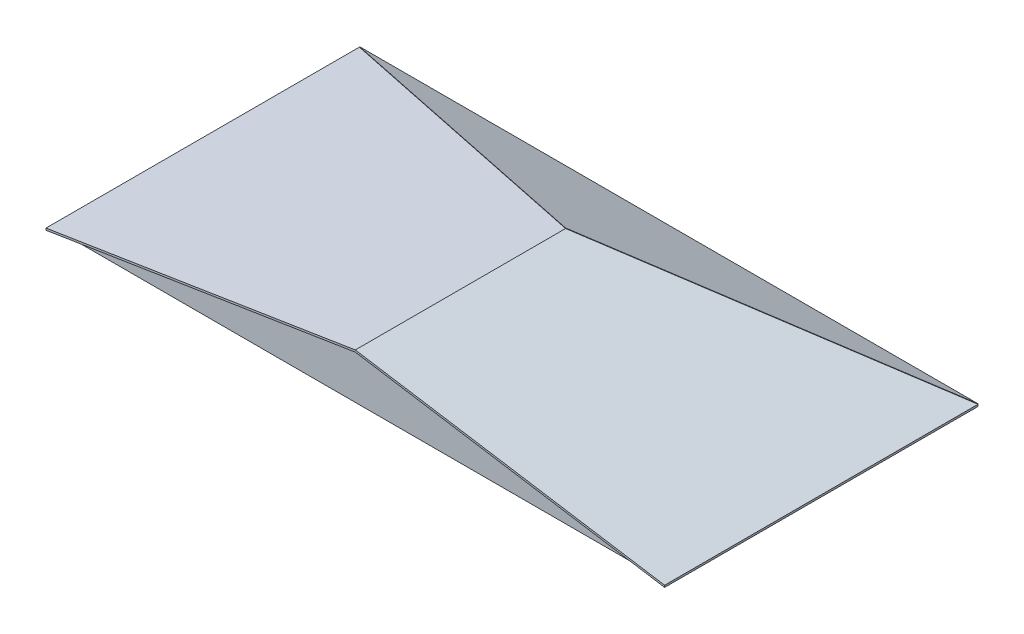
ISO-10303-21;
HEADER;
FILE_DESCRIPTION(('STEP AP214'),'2;1');
FILE_NAME('part.step','',(''),(''),'','','');
FILE_SCHEMA(('AUTOMOTIVE_DESIGN { 1 0 10303 214 1 1 1 1 }'));
ENDSEC;
DATA;
#1=APPLICATION_CONTEXT('core data for automotive mechanical design processes');
#2=APPLICATION_PROTOCOL_DEFINITION('international standard','automotive_design',2000,#1);
#3=PRODUCT_CONTEXT('',#1,'mechanical');
#4=PRODUCT('Part','Part','',(#3));
#5=PRODUCT_RELATED_PRODUCT_CATEGORY('part','',(#4));
#6=PRODUCT_DEFINITION_FORMATION('','',#4);
#7=PRODUCT_DEFINITION_CONTEXT('part definition',#1,'design');
#8=PRODUCT_DEFINITION('design','',#6,#7);
#9=PRODUCT_DEFINITION_SHAPE('','',#8);
#10=(LENGTH_UNIT() NAMED_UNIT(*) SI_UNIT(.MILLI.,.METRE.));
#11=(NAMED_UNIT(*) PLANE_ANGLE_UNIT() SI_UNIT($,.RADIAN.));
#12=(NAMED_UNIT(*) SI_UNIT($,.STERADIAN.) SOLID_ANGLE_UNIT());
#13=UNCERTAINTY_MEASURE_WITH_UNIT(LENGTH_MEASURE(1.E-05),#10,'distance_accuracy_value','');
#14=(GEOMETRIC_REPRESENTATION_CONTEXT(3) GLOBAL_UNCERTAINTY_ASSIGNED_CONTEXT((#13)) GLOBAL_UNIT_ASSIGNED_CONTEXT((#10,
#11,#12)) REPRESENTATION_CONTEXT('',''));
#15=CARTESIAN_POINT('',(0.,0.,0.));
#16=DIRECTION('',(0.,0.,1.));
#17=DIRECTION('',(1.,0.,0.));
#18=AXIS2_PLACEMENT_3D('',#15,#16,#17);
#19=CARTESIAN_POINT('',(4.15726659622467E-13,863.6,711.2));
#20=DIRECTION('',(0.,0.,1.));
#21=DIRECTION('',(0.,-1.,0.));
#22=AXIS2_PLACEMENT_3D('',#19,#20,#21);
#23=PLANE('',#22);
#24=DIRECTION('',(-1.,0.,0.));
#25=VECTOR('',#24,1.);
#26=CARTESIAN_POINT('',(-800.099999999999,609.6,711.2));
#27=LINE('',#26,#25);
#28=CARTESIAN_POINT('',(1600.20000000001,609.6,711.2));
#29=VERTEX_POINT('',#28);
#30=CARTESIAN_POINT('',(-1600.2,609.6,711.2));
#31=VERTEX_POINT('',#30);
#32=EDGE_CURVE('E2798',#29,#31,#27,.T.);
#33=ORIENTED_EDGE('',*,*,#32,.F.);
#34=DIRECTION('',(-0.987635528464464,0.156767544200705,0.));
#35=VECTOR('',#34,1.);
#36=CARTESIAN_POINT('',(-1.22420524372692E-12,863.599999999995,711.2));
#37=LINE('',#36,#35);
#38=CARTESIAN_POINT('',(-1.0547118733939E-12,863.599999999995,711.2));
#39=VERTEX_POINT('',#38);
#40=EDGE_CURVE('E2942',#29,#39,#37,.T.);
#41=ORIENTED_EDGE('',*,*,#40,.T.);
#42=DIRECTION('',(0.987635528464464,0.156767544200705,0.));
#43=VECTOR('',#42,1.);
#44=CARTESIAN_POINT('',(1.22420524372692E-12,863.599999999995,711.2));
#45=LINE('',#44,#43);
#46=EDGE_CURVE('E13',#31,#39,#45,.T.);
#47=ORIENTED_EDGE('',*,*,#46,.F.);
#48=EDGE_LOOP('',(#33,#41,#47));
#49=FACE_BOUND('',#48,.T.);
#50=ADVANCED_FACE('F2790',(#49),#23,.T.);
#51=CARTESIAN_POINT('',(4.44089209850063E-13,609.6,711.2));
#52=DIRECTION('',(0.,-1.,0.));
#53=DIRECTION('',(0.,0.,-1.));
#54=AXIS2_PLACEMENT_3D('',#51,#52,#53);
#55=PLANE('',#54);
#56=DIRECTION('',(-1.,0.,0.));
#57=VECTOR('',#56,1.);
#58=CARTESIAN_POINT('',(-800.099999999999,609.6,-901.7));
#59=LINE('',#58,#57);
#60=CARTESIAN_POINT('',(1600.2,609.6,-901.7));
#61=VERTEX_POINT('',#60);
#62=CARTESIAN_POINT('',(-1600.2,609.6,-901.699999999999));
#63=VERTEX_POINT('',#62);
#64=EDGE_CURVE('E2811',#61,#63,#59,.T.);
#65=ORIENTED_EDGE('',*,*,#64,.F.);
#66=DIRECTION('',(0.,0.,-1.));
#67=VECTOR('',#66,1.);
#68=CARTESIAN_POINT('',(1600.2,609.6,-95.2500000000001));
#69=LINE('',#68,#67);
#70=EDGE_CURVE('E2939',#29,#61,#69,.T.);
#71=ORIENTED_EDGE('',*,*,#70,.F.);
#72=ORIENTED_EDGE('',*,*,#32,.T.);
#73=DIRECTION('',(0.,0.,-1.));
#74=VECTOR('',#73,1.);
#75=CARTESIAN_POINT('',(-1600.2,609.6,-95.2500000000001));
#76=LINE('',#75,#74);
#77=EDGE_CURVE('E2944',#31,#63,#76,.T.);
#78=ORIENTED_EDGE('',*,*,#77,.T.);
#79=EDGE_LOOP('',(#65,#71,#72,#78));
#80=FACE_BOUND('',#79,.T.);
#81=ADVANCED_FACE('F2792',(#80),#55,.T.);
#82=CARTESIAN_POINT('',(-1.0547118733939E-12,873.759999999995,736.6));
#83=DIRECTION('',(0.,0.,-1.));
#84=DIRECTION('',(-1.,0.,0.));
#85=AXIS2_PLACEMENT_3D('',#82,#83,#84);
#86=PLANE('',#85);
#87=DIRECTION('',(0.987635528464463,-0.156767544200705,0.));
#88=VECTOR('',#87,1.);
#89=CARTESIAN_POINT('',(-1.0547118733939E-12,863.599999999995,736.6));
#90=LINE('',#89,#88);
#91=CARTESIAN_POINT('',(1.0547118733939E-12,863.599999999995,736.6));
#92=VERTEX_POINT('',#91);
#93=CARTESIAN_POINT('',(1625.285942423,605.618104377303,736.599999999999));
#94=VERTEX_POINT('',#93);
#95=EDGE_CURVE('E2929',#92,#94,#90,.T.);
#96=ORIENTED_EDGE('',*,*,#95,.T.);
#97=DIRECTION('',(0.,-1.,0.));
#98=VECTOR('',#97,1.);
#99=CARTESIAN_POINT('',(1625.285942423,615.778104377303,736.599999999999));
#100=LINE('',#99,#98);
#101=CARTESIAN_POINT('',(1625.285942423,615.778104377303,736.599999999999));
#102=VERTEX_POINT('',#101);
#103=EDGE_CURVE('E2936',#102,#94,#100,.T.);
#104=ORIENTED_EDGE('',*,*,#103,.F.);
#105=DIRECTION('',(0.987635528464463,-0.156767544200705,0.));
#106=VECTOR('',#105,1.);
#107=CARTESIAN_POINT('',(-1.0547118733939E-12,873.759999999995,736.6));
#108=LINE('',#107,#106);
#109=CARTESIAN_POINT('',(-1.0547118733939E-12,873.759999999995,736.6));
#110=VERTEX_POINT('',#109);
#111=EDGE_CURVE('E2918',#110,#102,#108,.T.);
#112=ORIENTED_EDGE('',*,*,#111,.F.);
#113=DIRECTION('',(-0.987635528464463,-0.156767544200705,0.));
#114=VECTOR('',#113,1.);
#115=CARTESIAN_POINT('',(1.0547118733939E-12,873.759999999995,736.6));
#116=LINE('',#115,#114);
#117=CARTESIAN_POINT('',(-1625.285942423,615.778104377303,736.599999999999));
#118=VERTEX_POINT('',#117);
#119=EDGE_CURVE('E2902',#110,#118,#116,.T.);
#120=ORIENTED_EDGE('',*,*,#119,.T.);
#121=DIRECTION('',(0.,-1.,0.));
#122=VECTOR('',#121,1.);
#123=CARTESIAN_POINT('',(-1625.285942423,615.778104377303,736.599999999999));
#124=LINE('',#123,#122);
#125=CARTESIAN_POINT('',(-1625.285942423,605.618104377303,736.599999999999));
#126=VERTEX_POINT('',#125);
#127=EDGE_CURVE('E2904',#118,#126,#124,.T.);
#128=ORIENTED_EDGE('',*,*,#127,.T.);
#129=DIRECTION('',(-0.987635528464463,-0.156767544200705,0.));
#130=VECTOR('',#129,1.);
#131=CARTESIAN_POINT('',(1.0547118733939E-12,863.599999999995,736.6));
#132=LINE('',#131,#130);
#133=EDGE_CURVE('E2899',#92,#126,#132,.T.);
#134=ORIENTED_EDGE('',*,*,#133,.F.);
#135=EDGE_LOOP('',(#96,#104,#112,#120,#128,#134));
#136=FACE_BOUND('',#135,.T.);
#137=ADVANCED_FACE('F2980',(#136),#86,.F.);
#138=CARTESIAN_POINT('',(1625.285942423,615.778104377303,736.599999999999));
#139=DIRECTION('',(-1.,0.,0.));
#140=DIRECTION('',(0.,0.,1.));
#141=AXIS2_PLACEMENT_3D('',#138,#139,#140);
#142=PLANE('',#141);
#143=DIRECTION('',(0.,0.,-1.));
#144=VECTOR('',#143,1.);
#145=CARTESIAN_POINT('',(1625.285942423,605.618104377303,736.599999999999));
#146=LINE('',#145,#144);
#147=CARTESIAN_POINT('',(1625.285942423,605.618104377302,-910.061980807667));
#148=VERTEX_POINT('',#147);
#149=EDGE_CURVE('E2931',#94,#148,#146,.T.);
#150=ORIENTED_EDGE('',*,*,#149,.T.);
#151=DIRECTION('',(0.,-1.,0.));
#152=VECTOR('',#151,1.);
#153=CARTESIAN_POINT('',(1625.285942423,615.778104377303,-910.061980807667));
#154=LINE('',#153,#152);
#155=CARTESIAN_POINT('',(1625.285942423,615.778104377303,-910.061980807667));
#156=VERTEX_POINT('',#155);
#157=EDGE_CURVE('E2926',#156,#148,#154,.T.);
#158=ORIENTED_EDGE('',*,*,#157,.F.);
#159=DIRECTION('',(0.,0.,-1.));
#160=VECTOR('',#159,1.);
#161=CARTESIAN_POINT('',(1625.285942423,615.778104377303,736.599999999999));
#162=LINE('',#161,#160);
#163=EDGE_CURVE('E2921',#102,#156,#162,.T.);
#164=ORIENTED_EDGE('',*,*,#163,.F.);
#165=ORIENTED_EDGE('',*,*,#103,.T.);
#166=EDGE_LOOP('',(#150,#158,#164,#165));
#167=FACE_BOUND('',#166,.T.);
#168=ADVANCED_FACE('F2971',(#167),#142,.F.);
#169=CARTESIAN_POINT('',(133.710493978861,852.536112066844,2.5393031632116E-13));
#170=DIRECTION('',(-0.156767544200705,-0.987635528464464,0.));
#171=DIRECTION('',(0.987635528464464,-0.156767544200705,0.));
#172=AXIS2_PLACEMENT_3D('',#169,#170,#171);
#173=PLANE('',#172);
#174=DIRECTION('',(0.,0.,1.));
#175=VECTOR('',#174,1.);
#176=CARTESIAN_POINT('',(-1.0547118733939E-12,873.759999999995,736.6));
#177=LINE('',#176,#175);
#178=CARTESIAN_POINT('',(-1.05644659686988E-12,873.759999999996,-368.300000000002));
#179=VERTEX_POINT('',#178);
#180=EDGE_CURVE('E2915',#179,#110,#177,.T.);
#181=ORIENTED_EDGE('',*,*,#180,.T.);
#182=ORIENTED_EDGE('',*,*,#111,.T.);
#183=ORIENTED_EDGE('',*,*,#163,.T.);
#184=DIRECTION('',(-0.93810678810997,0.148905839382532,0.312702262703324));
#185=VECTOR('',#184,1.);
#186=CARTESIAN_POINT('',(-1.0547118733939E-12,873.759999999996,-368.3));
#187=LINE('',#186,#185);
#188=EDGE_CURVE('E2924',#156,#179,#187,.T.);
#189=ORIENTED_EDGE('',*,*,#188,.T.);
#190=EDGE_LOOP('',(#181,#182,#183,#189));
#191=FACE_BOUND('',#190,.T.);
#192=ADVANCED_FACE('F2964',(#191),#173,.F.);
#193=CARTESIAN_POINT('',(133.710493978861,842.376112066844,2.5393031632116E-13));
#194=DIRECTION('',(-0.156767544200705,-0.987635528464464,0.));
#195=DIRECTION('',(0.987635528464464,-0.156767544200705,0.));
#196=AXIS2_PLACEMENT_3D('',#193,#194,#195);
#197=PLANE('',#196);
#198=DIRECTION('',(0.,0.,1.));
#199=VECTOR('',#198,1.);
#200=CARTESIAN_POINT('',(-1.0547118733939E-12,863.599999999995,736.6));
#201=LINE('',#200,#199);
#202=EDGE_CURVE('E2914',#39,#92,#201,.T.);
#203=ORIENTED_EDGE('',*,*,#202,.F.);
#204=ORIENTED_EDGE('',*,*,#40,.F.);
#205=ORIENTED_EDGE('',*,*,#70,.T.);
#206=DIRECTION('',(-0.93810678810997,0.148905839382532,0.312702262703324));
#207=VECTOR('',#206,1.);
#208=CARTESIAN_POINT('',(-1.0547118733939E-12,863.599999999996,-368.3));
#209=LINE('',#208,#207);
#210=EDGE_CURVE('E2919',#148,#61,#209,.T.);
#211=ORIENTED_EDGE('',*,*,#210,.F.);
#212=ORIENTED_EDGE('',*,*,#149,.F.);
#213=ORIENTED_EDGE('',*,*,#95,.F.);
#214=EDGE_LOOP('',(#203,#204,#205,#211,#212,#213));
#215=FACE_BOUND('',#214,.T.);
#216=ADVANCED_FACE('F2975',(#215),#197,.T.);
#217=CARTESIAN_POINT('',(-1625.285942423,615.778104377303,736.599999999999));
#218=DIRECTION('',(-1.,0.,0.));
#219=DIRECTION('',(0.,0.,1.));
#220=AXIS2_PLACEMENT_3D('',#217,#218,#219);
#221=PLANE('',#220);
#222=DIRECTION('',(0.,0.,-1.));
#223=VECTOR('',#222,1.);
#224=CARTESIAN_POINT('',(-1625.285942423,605.618104377303,736.599999999999));
#225=LINE('',#224,#223);
#226=CARTESIAN_POINT('',(-1625.285942423,605.618104377302,-910.061980807666));
#227=VERTEX_POINT('',#226);
#228=EDGE_CURVE('E2891',#126,#227,#225,.T.);
#229=ORIENTED_EDGE('',*,*,#228,.F.);
#230=ORIENTED_EDGE('',*,*,#127,.F.);
#231=DIRECTION('',(0.,0.,-1.));
#232=VECTOR('',#231,1.);
#233=CARTESIAN_POINT('',(-1625.285942423,615.778104377303,736.599999999999));
#234=LINE('',#233,#232);
#235=CARTESIAN_POINT('',(-1625.285942423,615.778104377304,-910.061980807666));
#236=VERTEX_POINT('',#235);
#237=EDGE_CURVE('E2898',#118,#236,#234,.T.);
#238=ORIENTED_EDGE('',*,*,#237,.T.);
#239=DIRECTION('',(0.,-1.,0.));
#240=VECTOR('',#239,1.);
#241=CARTESIAN_POINT('',(-1625.285942423,615.778104377303,-910.061980807667));
#242=LINE('',#241,#240);
#243=EDGE_CURVE('E2911',#236,#227,#242,.T.);
#244=ORIENTED_EDGE('',*,*,#243,.T.);
#245=EDGE_LOOP('',(#229,#230,#238,#244));
#246=FACE_BOUND('',#245,.T.);
#247=ADVANCED_FACE('F2955',(#246),#221,.T.);
#248=CARTESIAN_POINT('',(-133.710493978861,852.536112066844,2.5393031632116E-13));
#249=DIRECTION('',(0.156767544200705,-0.987635528464464,0.));
#250=DIRECTION('',(-0.987635528464464,-0.156767544200705,0.));
#251=AXIS2_PLACEMENT_3D('',#248,#249,#250);
#252=PLANE('',#251);
#253=ORIENTED_EDGE('',*,*,#180,.F.);
#254=DIRECTION('',(0.93810678810997,0.148905839382532,0.312702262703324));
#255=VECTOR('',#254,1.);
#256=CARTESIAN_POINT('',(1.0547118733939E-12,873.759999999996,-368.3));
#257=LINE('',#256,#255);
#258=EDGE_CURVE('E2887',#236,#179,#257,.T.);
#259=ORIENTED_EDGE('',*,*,#258,.F.);
#260=ORIENTED_EDGE('',*,*,#237,.F.);
#261=ORIENTED_EDGE('',*,*,#119,.F.);
#262=EDGE_LOOP('',(#253,#259,#260,#261));
#263=FACE_BOUND('',#262,.T.);
#264=ADVANCED_FACE('F2961',(#263),#252,.F.);
#265=CARTESIAN_POINT('',(-133.710493978861,842.376112066844,2.5393031632116E-13));
#266=DIRECTION('',(0.156767544200705,-0.987635528464464,0.));
#267=DIRECTION('',(-0.987635528464464,-0.156767544200705,0.));
#268=AXIS2_PLACEMENT_3D('',#265,#266,#267);
#269=PLANE('',#268);
#270=ORIENTED_EDGE('',*,*,#77,.F.);
#271=ORIENTED_EDGE('',*,*,#46,.T.);
#272=ORIENTED_EDGE('',*,*,#202,.T.);
#273=ORIENTED_EDGE('',*,*,#133,.T.);
#274=ORIENTED_EDGE('',*,*,#228,.T.);
#275=DIRECTION('',(0.93810678810997,0.148905839382532,0.312702262703324));
#276=VECTOR('',#275,1.);
#277=CARTESIAN_POINT('',(1.0547118733939E-12,863.599999999996,-368.3));
#278=LINE('',#277,#276);
#279=EDGE_CURVE('E2888',#227,#63,#278,.T.);
#280=ORIENTED_EDGE('',*,*,#279,.T.);
#281=EDGE_LOOP('',(#270,#271,#272,#273,#274,#280));
#282=FACE_BOUND('',#281,.T.);
#283=ADVANCED_FACE('F2950',(#282),#269,.T.);
#284=CARTESIAN_POINT('',(-1.0547118733939E-12,876.3,-368.300000000002));
#285=DIRECTION('',(-0.316227766016837,0.,-0.948683298050514));
#286=DIRECTION('',(-0.948683298050514,0.,0.316227766016837));
#287=AXIS2_PLACEMENT_3D('',#284,#285,#286);
#288=PLANE('',#287);
#289=DIRECTION('',(0.,-1.,0.));
#290=VECTOR('',#289,1.);
#291=CARTESIAN_POINT('',(-1.0547118733939E-12,876.3,-368.300000000002));
#292=LINE('',#291,#290);
#293=CARTESIAN_POINT('',(-1.0547118733939E-12,876.3,-368.300000000002));
#294=VERTEX_POINT('',#293);
#295=EDGE_CURVE('E2869',#294,#179,#292,.T.);
#296=ORIENTED_EDGE('',*,*,#295,.T.);
#297=ORIENTED_EDGE('',*,*,#188,.F.);
#298=DIRECTION('',(0.,-1.,0.));
#299=VECTOR('',#298,1.);
#300=CARTESIAN_POINT('',(1625.285942423,618.318104377302,-910.061980807667));
#301=LINE('',#300,#299);
#302=CARTESIAN_POINT('',(1625.285942423,618.318104377302,-910.061980807667));
#303=VERTEX_POINT('',#302);
#304=EDGE_CURVE('E2872',#303,#156,#301,.T.);
#305=ORIENTED_EDGE('',*,*,#304,.F.);
#306=DIRECTION('',(0.93810678810997,-0.148905839382535,-0.312702262703323));
#307=VECTOR('',#306,1.);
#308=CARTESIAN_POINT('',(-1.0547118733939E-12,876.3,-368.300000000002));
#309=LINE('',#308,#307);
#310=EDGE_CURVE('E2865',#294,#303,#309,.T.);
#311=ORIENTED_EDGE('',*,*,#310,.F.);
#312=EDGE_LOOP('',(#296,#297,#305,#311));
#313=FACE_BOUND('',#312,.T.);
#314=ADVANCED_FACE('F2867',(#313),#288,.F.);
#315=CARTESIAN_POINT('',(-1.0547118733939E-12,876.3,-368.300000000002));
#316=DIRECTION('',(0.316227766016838,0.,-0.948683298050514));
#317=DIRECTION('',(-0.948683298050514,0.,-0.316227766016838));
#318=AXIS2_PLACEMENT_3D('',#315,#316,#317);
#319=PLANE('',#318);
#320=DIRECTION('',(0.,-1.,0.));
#321=VECTOR('',#320,1.);
#322=CARTESIAN_POINT('',(-1625.285942423,618.318104377302,-910.061980807666));
#323=LINE('',#322,#321);
#324=CARTESIAN_POINT('',(-1625.285942423,618.318104377302,-910.061980807666));
#325=VERTEX_POINT('',#324);
#326=EDGE_CURVE('E2893',#325,#236,#323,.T.);
#327=ORIENTED_EDGE('',*,*,#326,.T.);
#328=ORIENTED_EDGE('',*,*,#258,.T.);
#329=ORIENTED_EDGE('',*,*,#295,.F.);
#330=DIRECTION('',(0.93810678810997,0.148905839382535,0.312702262703323));
#331=VECTOR('',#330,1.);
#332=CARTESIAN_POINT('',(-1.0547118733939E-12,876.3,-368.300000000002));
#333=LINE('',#332,#331);
#334=EDGE_CURVE('E2876',#325,#294,#333,.T.);
#335=ORIENTED_EDGE('',*,*,#334,.F.);
#336=EDGE_LOOP('',(#327,#328,#329,#335));
#337=FACE_BOUND('',#336,.T.);
#338=ADVANCED_FACE('F2885',(#337),#319,.F.);
#339=CARTESIAN_POINT('',(-1625.285942423,618.318104377302,-910.061980807666));
#340=DIRECTION('',(0.,0.,1.));
#341=DIRECTION('',(1.,0.,0.));
#342=AXIS2_PLACEMENT_3D('',#339,#340,#341);
#343=PLANE('',#342);
#344=DIRECTION('',(-1.,0.,0.));
#345=VECTOR('',#344,1.);
#346=CARTESIAN_POINT('',(-1625.285942423,605.618104377302,-910.061980807666));
#347=LINE('',#346,#345);
#348=EDGE_CURVE('E2883',#148,#227,#347,.T.);
#349=ORIENTED_EDGE('',*,*,#348,.T.);
#350=ORIENTED_EDGE('',*,*,#243,.F.);
#351=ORIENTED_EDGE('',*,*,#326,.F.);
#352=DIRECTION('',(-1.,0.,0.));
#353=VECTOR('',#352,1.);
#354=CARTESIAN_POINT('',(-1625.285942423,618.318104377302,-910.061980807666));
#355=LINE('',#354,#353);
#356=EDGE_CURVE('E2875',#303,#325,#355,.T.);
#357=ORIENTED_EDGE('',*,*,#356,.F.);
#358=ORIENTED_EDGE('',*,*,#304,.T.);
#359=ORIENTED_EDGE('',*,*,#157,.T.);
#360=EDGE_LOOP('',(#349,#350,#351,#357,#358,#359));
#361=FACE_BOUND('',#360,.T.);
#362=ADVANCED_FACE('F2958',(#361),#343,.F.);
#363=CARTESIAN_POINT('',(0.,859.632717190388,-403.301293900185));
#364=DIRECTION('',(0.,-0.90286051882393,0.429933580392348));
#365=DIRECTION('',(0.,-0.429933580392348,-0.90286051882393));
#366=AXIS2_PLACEMENT_3D('',#363,#364,#365);
#367=PLANE('',#366);
#368=ORIENTED_EDGE('',*,*,#334,.T.);
#369=ORIENTED_EDGE('',*,*,#310,.T.);
#370=ORIENTED_EDGE('',*,*,#356,.T.);
#371=EDGE_LOOP('',(#368,#369,#370));
#372=FACE_BOUND('',#371,.T.);
#373=ADVANCED_FACE('F2879',(#372),#367,.F.);
#374=CARTESIAN_POINT('',(0.,846.932717190388,-403.301293900185));
#375=DIRECTION('',(0.,-0.90286051882393,0.429933580392348));
#376=DIRECTION('',(0.,-0.429933580392348,-0.90286051882393));
#377=AXIS2_PLACEMENT_3D('',#374,#375,#376);
#378=PLANE('',#377);
#379=ORIENTED_EDGE('',*,*,#210,.T.);
#380=ORIENTED_EDGE('',*,*,#64,.T.);
#381=ORIENTED_EDGE('',*,*,#279,.F.);
#382=ORIENTED_EDGE('',*,*,#348,.F.);
#383=EDGE_LOOP('',(#379,#380,#381,#382));
#384=FACE_BOUND('',#383,.T.);
#385=ADVANCED_FACE('F2953',(#384),#378,.T.);
#386=CLOSED_SHELL('',(#50,#81,#137,#168,#192,#216,#247,#264,#283,#314,#338,#362,#373,#385));
#387=MANIFOLD_SOLID_BREP('B2',#386);
#388=ADVANCED_BREP_SHAPE_REPRESENTATION('',(#18,#387),#14);
#389=SHAPE_DEFINITION_REPRESENTATION(#9,#388);
ENDSEC;
END-ISO-10303-21;
